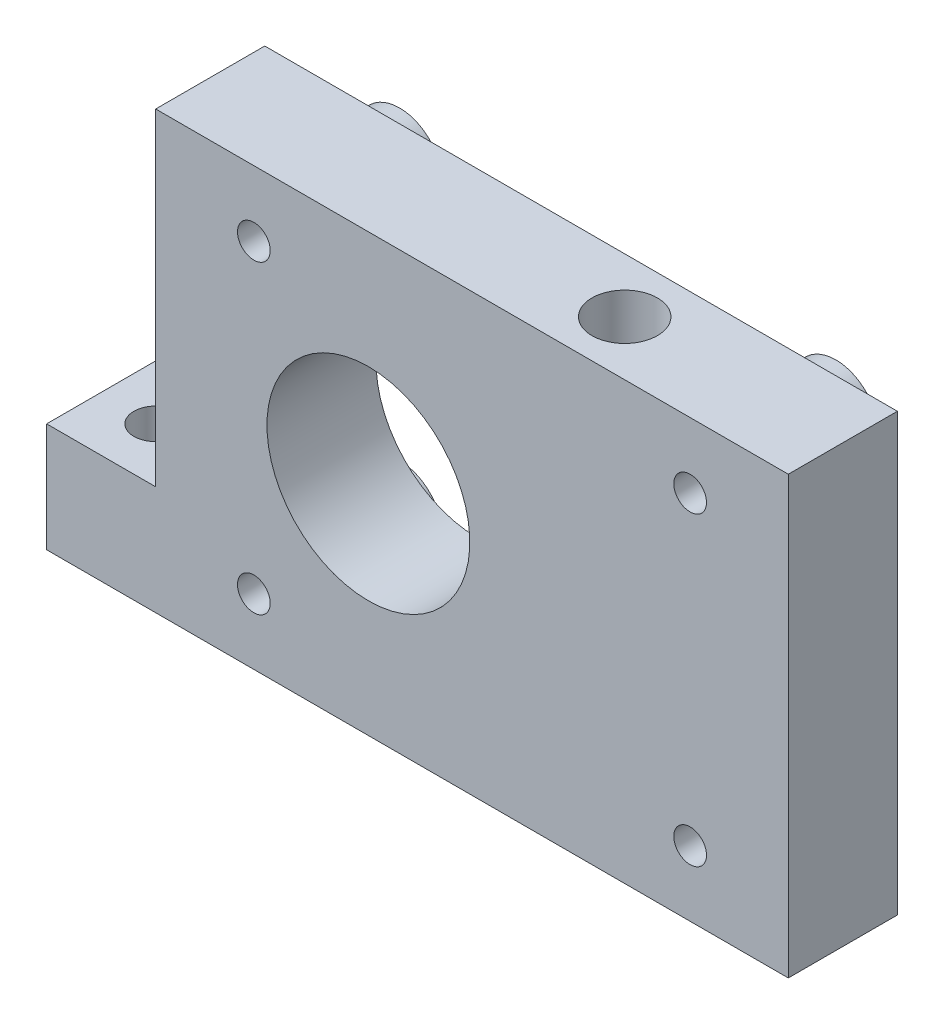
ISO-10303-21;
HEADER;
FILE_DESCRIPTION(('STEP AP214'),'2;1');
FILE_NAME('part.step','',(''),(''),'','','');
FILE_SCHEMA(('AUTOMOTIVE_DESIGN { 1 0 10303 214 1 1 1 1 }'));
ENDSEC;
DATA;
#1=APPLICATION_CONTEXT('core data for automotive mechanical design processes');
#2=APPLICATION_PROTOCOL_DEFINITION('international standard','automotive_design',2000,#1);
#3=PRODUCT_CONTEXT('',#1,'mechanical');
#4=PRODUCT('Part','Part','',(#3));
#5=PRODUCT_RELATED_PRODUCT_CATEGORY('part','',(#4));
#6=PRODUCT_DEFINITION_FORMATION('','',#4);
#7=PRODUCT_DEFINITION_CONTEXT('part definition',#1,'design');
#8=PRODUCT_DEFINITION('design','',#6,#7);
#9=PRODUCT_DEFINITION_SHAPE('','',#8);
#10=(LENGTH_UNIT() NAMED_UNIT(*) SI_UNIT(.MILLI.,.METRE.));
#11=(NAMED_UNIT(*) PLANE_ANGLE_UNIT() SI_UNIT($,.RADIAN.));
#12=(NAMED_UNIT(*) SI_UNIT($,.STERADIAN.) SOLID_ANGLE_UNIT());
#13=UNCERTAINTY_MEASURE_WITH_UNIT(LENGTH_MEASURE(1.E-05),#10,'distance_accuracy_value','');
#14=(GEOMETRIC_REPRESENTATION_CONTEXT(3) GLOBAL_UNCERTAINTY_ASSIGNED_CONTEXT((#13)) GLOBAL_UNIT_ASSIGNED_CONTEXT((#10,
#11,#12)) REPRESENTATION_CONTEXT('',''));
#15=CARTESIAN_POINT('',(0.,0.,0.));
#16=DIRECTION('',(0.,0.,1.));
#17=DIRECTION('',(1.,0.,0.));
#18=AXIS2_PLACEMENT_3D('',#15,#16,#17);
#19=CARTESIAN_POINT('',(-49.,7.8359502095322,24.3924178005197));
#20=DIRECTION('',(0.,0.,-1.));
#21=DIRECTION('',(-1.,0.,0.));
#22=AXIS2_PLACEMENT_3D('',#19,#20,#21);
#23=CYLINDRICAL_SURFACE('',#22,3.9);
#24=CARTESIAN_POINT('',(-49.,7.8359502095322,0.));
#25=DIRECTION('',(0.,0.,1.));
#26=DIRECTION('',(1.,0.,0.));
#27=AXIS2_PLACEMENT_3D('',#24,#25,#26);
#28=CIRCLE('',#27,3.9);
#29=CARTESIAN_POINT('',(-45.1,7.8359502095322,0.));
#30=VERTEX_POINT('',#29);
#31=EDGE_CURVE('E278',#30,#30,#28,.T.);
#32=ORIENTED_EDGE('',*,*,#31,.T.);
#33=EDGE_LOOP('',(#32));
#34=FACE_BOUND('',#33,.T.);
#35=CARTESIAN_POINT('',(-49.,7.8359502095322,3.36155201400951));
#36=DIRECTION('',(0.,0.,1.));
#37=DIRECTION('',(0.,-1.,0.));
#38=AXIS2_PLACEMENT_3D('',#35,#36,#37);
#39=CIRCLE('',#38,3.9);
#40=CARTESIAN_POINT('',(-49.,3.9359502095322,3.36155201400951));
#41=VERTEX_POINT('',#40);
#42=EDGE_CURVE('E12',#41,#41,#39,.T.);
#43=ORIENTED_EDGE('',*,*,#42,.F.);
#44=EDGE_LOOP('',(#43));
#45=FACE_BOUND('',#44,.T.);
#46=ADVANCED_FACE('F110',(#34,#45),#23,.T.);
#47=CARTESIAN_POINT('',(-49.,7.8359502095322,0.));
#48=DIRECTION('',(0.,0.,1.));
#49=DIRECTION('',(1.,0.,0.));
#50=AXIS2_PLACEMENT_3D('',#47,#48,#49);
#51=PLANE('',#50);
#52=ORIENTED_EDGE('',*,*,#31,.F.);
#53=EDGE_LOOP('',(#52));
#54=FACE_BOUND('',#53,.T.);
#55=CARTESIAN_POINT('',(-49.,7.8359502095322,0.));
#56=DIRECTION('',(0.,0.,1.));
#57=DIRECTION('',(1.,0.,0.));
#58=AXIS2_PLACEMENT_3D('',#55,#56,#57);
#59=CIRCLE('',#58,1.5);
#60=CARTESIAN_POINT('',(-47.5,7.8359502095322,0.));
#61=VERTEX_POINT('',#60);
#62=EDGE_CURVE('E274',#61,#61,#59,.T.);
#63=ORIENTED_EDGE('',*,*,#62,.T.);
#64=EDGE_LOOP('',(#63));
#65=FACE_BOUND('',#64,.T.);
#66=ADVANCED_FACE('F291',(#54,#65),#51,.F.);
#67=CARTESIAN_POINT('',(-49.,7.8359502095322,24.3924178005197));
#68=DIRECTION('',(0.,0.,-1.));
#69=DIRECTION('',(-1.,0.,0.));
#70=AXIS2_PLACEMENT_3D('',#67,#68,#69);
#71=CYLINDRICAL_SURFACE('',#70,1.5);
#72=CARTESIAN_POINT('',(-49.,7.8359502095322,13.3615520140095));
#73=DIRECTION('',(0.,0.,-1.));
#74=DIRECTION('',(0.,1.,0.));
#75=AXIS2_PLACEMENT_3D('',#72,#73,#74);
#76=CIRCLE('',#75,1.5);
#77=CARTESIAN_POINT('',(-49.,9.3359502095322,13.3615520140095));
#78=VERTEX_POINT('',#77);
#79=EDGE_CURVE('E119',#78,#78,#76,.T.);
#80=ORIENTED_EDGE('',*,*,#79,.F.);
#81=EDGE_LOOP('',(#80));
#82=FACE_BOUND('',#81,.T.);
#83=ORIENTED_EDGE('',*,*,#62,.F.);
#84=EDGE_LOOP('',(#83));
#85=FACE_BOUND('',#84,.T.);
#86=ADVANCED_FACE('F288',(#82,#85),#71,.F.);
#87=CARTESIAN_POINT('',(-54.3475713263686,-9.86404979047036,13.3615520140095));
#88=DIRECTION('',(0.,0.,-1.));
#89=DIRECTION('',(1.,0.,0.));
#90=AXIS2_PLACEMENT_3D('',#87,#88,#89);
#91=PLANE('',#90);
#92=ORIENTED_EDGE('',*,*,#79,.T.);
#93=EDGE_LOOP('',(#92));
#94=FACE_BOUND('',#93,.T.);
#95=DIRECTION('',(1.,0.,0.));
#96=VECTOR('',#95,1.);
#97=CARTESIAN_POINT('',(-54.3475713263686,1.83595020953219,13.3615520140095));
#98=LINE('',#97,#96);
#99=CARTESIAN_POINT('',(-68.,1.83595020952963,13.3615520140095));
#100=VERTEX_POINT('',#99);
#101=CARTESIAN_POINT('',(0.,1.8359502095322,13.3615520140095));
#102=VERTEX_POINT('',#101);
#103=EDGE_CURVE('E255',#100,#102,#98,.T.);
#104=ORIENTED_EDGE('',*,*,#103,.T.);
#105=DIRECTION('',(0.,1.,0.));
#106=VECTOR('',#105,1.);
#107=CARTESIAN_POINT('',(0.,-9.86404979047036,13.3615520140095));
#108=LINE('',#107,#106);
#109=CARTESIAN_POINT('',(0.,41.8359502095322,13.3615520140095));
#110=VERTEX_POINT('',#109);
#111=EDGE_CURVE('E267',#102,#110,#108,.T.);
#112=ORIENTED_EDGE('',*,*,#111,.T.);
#113=DIRECTION('',(-1.,0.,0.));
#114=VECTOR('',#113,1.);
#115=CARTESIAN_POINT('',(-54.3475713263686,41.8359502095322,13.3615520140095));
#116=LINE('',#115,#114);
#117=CARTESIAN_POINT('',(-58.,41.8359502095322,13.3615520140095));
#118=VERTEX_POINT('',#117);
#119=EDGE_CURVE('E270',#110,#118,#116,.T.);
#120=ORIENTED_EDGE('',*,*,#119,.T.);
#121=DIRECTION('',(0.,-1.,0.));
#122=VECTOR('',#121,1.);
#123=CARTESIAN_POINT('',(-58.,-9.86404979047036,13.3615520140095));
#124=LINE('',#123,#122);
#125=CARTESIAN_POINT('',(-58.,11.8359502095296,13.3615520140095));
#126=VERTEX_POINT('',#125);
#127=EDGE_CURVE('E262',#118,#126,#124,.T.);
#128=ORIENTED_EDGE('',*,*,#127,.T.);
#129=DIRECTION('',(1.,0.,0.));
#130=VECTOR('',#129,1.);
#131=CARTESIAN_POINT('',(-58.,11.8359502095296,13.3615520140095));
#132=LINE('',#131,#130);
#133=CARTESIAN_POINT('',(-68.,11.8359502095296,13.3615520140095));
#134=VERTEX_POINT('',#133);
#135=EDGE_CURVE('E190',#134,#126,#132,.T.);
#136=ORIENTED_EDGE('',*,*,#135,.F.);
#137=DIRECTION('',(0.,-1.,0.));
#138=VECTOR('',#137,1.);
#139=CARTESIAN_POINT('',(-68.,11.8359502095296,13.3615520140095));
#140=LINE('',#139,#138);
#141=EDGE_CURVE('E201',#134,#100,#140,.T.);
#142=ORIENTED_EDGE('',*,*,#141,.T.);
#143=EDGE_LOOP('',(#104,#112,#120,#128,#136,#142));
#144=FACE_BOUND('',#143,.T.);
#145=CARTESIAN_POINT('',(-38.5,21.8359502095322,13.3615520140095));
#146=DIRECTION('',(0.,0.,-1.));
#147=DIRECTION('',(0.,1.,0.));
#148=AXIS2_PLACEMENT_3D('',#145,#146,#147);
#149=CIRCLE('',#148,9.3);
#150=CARTESIAN_POINT('',(-38.5,31.1359502095322,13.3615520140095));
#151=VERTEX_POINT('',#150);
#152=EDGE_CURVE('E251',#151,#151,#149,.T.);
#153=ORIENTED_EDGE('',*,*,#152,.T.);
#154=EDGE_LOOP('',(#153));
#155=FACE_BOUND('',#154,.T.);
#156=CARTESIAN_POINT('',(-49.,35.8359502095322,13.3615520140095));
#157=DIRECTION('',(0.,0.,-1.));
#158=DIRECTION('',(0.,1.,0.));
#159=AXIS2_PLACEMENT_3D('',#156,#157,#158);
#160=CIRCLE('',#159,1.5);
#161=CARTESIAN_POINT('',(-49.,37.3359502095322,13.3615520140095));
#162=VERTEX_POINT('',#161);
#163=EDGE_CURVE('E237',#162,#162,#160,.T.);
#164=ORIENTED_EDGE('',*,*,#163,.T.);
#165=EDGE_LOOP('',(#164));
#166=FACE_BOUND('',#165,.T.);
#167=CARTESIAN_POINT('',(-9.,35.8359502095322,13.3615520140095));
#168=DIRECTION('',(0.,0.,-1.));
#169=DIRECTION('',(0.,1.,0.));
#170=AXIS2_PLACEMENT_3D('',#167,#168,#169);
#171=CIRCLE('',#170,1.5);
#172=CARTESIAN_POINT('',(-9.,37.3359502095322,13.3615520140095));
#173=VERTEX_POINT('',#172);
#174=EDGE_CURVE('E228',#173,#173,#171,.T.);
#175=ORIENTED_EDGE('',*,*,#174,.T.);
#176=EDGE_LOOP('',(#175));
#177=FACE_BOUND('',#176,.T.);
#178=CARTESIAN_POINT('',(-9.,7.8359502095322,13.3615520140095));
#179=DIRECTION('',(0.,0.,-1.));
#180=DIRECTION('',(0.,1.,0.));
#181=AXIS2_PLACEMENT_3D('',#178,#179,#180);
#182=CIRCLE('',#181,1.5);
#183=CARTESIAN_POINT('',(-9.,9.3359502095322,13.3615520140095));
#184=VERTEX_POINT('',#183);
#185=EDGE_CURVE('E219',#184,#184,#182,.T.);
#186=ORIENTED_EDGE('',*,*,#185,.T.);
#187=EDGE_LOOP('',(#186));
#188=FACE_BOUND('',#187,.T.);
#189=ADVANCED_FACE('F112',(#94,#144,#155,#166,#177,#188),#91,.F.);
#190=CARTESIAN_POINT('',(0.,0.,3.36155201400951));
#191=DIRECTION('',(0.,0.,1.));
#192=DIRECTION('',(0.,-1.,0.));
#193=AXIS2_PLACEMENT_3D('',#190,#191,#192);
#194=PLANE('',#193);
#195=DIRECTION('',(1.,0.,0.));
#196=VECTOR('',#195,1.);
#197=CARTESIAN_POINT('',(-54.3475713263686,1.83595020953219,3.36155201400951));
#198=LINE('',#197,#196);
#199=CARTESIAN_POINT('',(-68.,1.83595020952963,3.36155201400952));
#200=VERTEX_POINT('',#199);
#201=CARTESIAN_POINT('',(0.,1.8359502095322,3.36155201400951));
#202=VERTEX_POINT('',#201);
#203=EDGE_CURVE('E258',#200,#202,#198,.T.);
#204=ORIENTED_EDGE('',*,*,#203,.F.);
#205=DIRECTION('',(0.,-1.,0.));
#206=VECTOR('',#205,1.);
#207=CARTESIAN_POINT('',(-68.,11.8359502095296,3.36155201400952));
#208=LINE('',#207,#206);
#209=CARTESIAN_POINT('',(-68.,11.8359502095296,3.36155201400952));
#210=VERTEX_POINT('',#209);
#211=EDGE_CURVE('E181',#210,#200,#208,.T.);
#212=ORIENTED_EDGE('',*,*,#211,.F.);
#213=DIRECTION('',(-1.,0.,0.));
#214=VECTOR('',#213,1.);
#215=CARTESIAN_POINT('',(-58.,11.8359502095296,3.36155201400951));
#216=LINE('',#215,#214);
#217=CARTESIAN_POINT('',(-58.,11.8359502095296,3.36155201400951));
#218=VERTEX_POINT('',#217);
#219=EDGE_CURVE('E177',#218,#210,#216,.T.);
#220=ORIENTED_EDGE('',*,*,#219,.F.);
#221=DIRECTION('',(0.,-1.,0.));
#222=VECTOR('',#221,1.);
#223=CARTESIAN_POINT('',(-58.,-9.86404979047036,3.36155201400951));
#224=LINE('',#223,#222);
#225=CARTESIAN_POINT('',(-58.,41.8359502095322,3.36155201400951));
#226=VERTEX_POINT('',#225);
#227=EDGE_CURVE('E169',#226,#218,#224,.T.);
#228=ORIENTED_EDGE('',*,*,#227,.F.);
#229=DIRECTION('',(-1.,0.,0.));
#230=VECTOR('',#229,1.);
#231=CARTESIAN_POINT('',(-54.3475713263686,41.8359502095322,3.36155201400951));
#232=LINE('',#231,#230);
#233=CARTESIAN_POINT('',(0.,41.8359502095322,3.36155201400951));
#234=VERTEX_POINT('',#233);
#235=EDGE_CURVE('E174',#234,#226,#232,.T.);
#236=ORIENTED_EDGE('',*,*,#235,.F.);
#237=DIRECTION('',(0.,1.,0.));
#238=VECTOR('',#237,1.);
#239=CARTESIAN_POINT('',(0.,-9.86404979047036,3.36155201400951));
#240=LINE('',#239,#238);
#241=EDGE_CURVE('E261',#202,#234,#240,.T.);
#242=ORIENTED_EDGE('',*,*,#241,.F.);
#243=EDGE_LOOP('',(#204,#212,#220,#228,#236,#242));
#244=FACE_BOUND('',#243,.T.);
#245=CARTESIAN_POINT('',(-38.5,21.8359502095322,3.36155201400951));
#246=DIRECTION('',(0.,0.,-1.));
#247=DIRECTION('',(0.,1.,0.));
#248=AXIS2_PLACEMENT_3D('',#245,#246,#247);
#249=CIRCLE('',#248,9.3);
#250=CARTESIAN_POINT('',(-38.5,31.1359502095322,3.36155201400951));
#251=VERTEX_POINT('',#250);
#252=EDGE_CURVE('E252',#251,#251,#249,.T.);
#253=ORIENTED_EDGE('',*,*,#252,.F.);
#254=EDGE_LOOP('',(#253));
#255=FACE_BOUND('',#254,.T.);
#256=CARTESIAN_POINT('',(-49.,35.8359502095322,3.36155201400951));
#257=DIRECTION('',(0.,0.,-1.));
#258=DIRECTION('',(0.,1.,0.));
#259=AXIS2_PLACEMENT_3D('',#256,#257,#258);
#260=CIRCLE('',#259,3.9);
#261=CARTESIAN_POINT('',(-49.,39.7359502095322,3.36155201400951));
#262=VERTEX_POINT('',#261);
#263=EDGE_CURVE('E248',#262,#262,#260,.T.);
#264=ORIENTED_EDGE('',*,*,#263,.F.);
#265=EDGE_LOOP('',(#264));
#266=FACE_BOUND('',#265,.T.);
#267=ORIENTED_EDGE('',*,*,#42,.T.);
#268=EDGE_LOOP('',(#267));
#269=FACE_BOUND('',#268,.T.);
#270=CARTESIAN_POINT('',(-9.00000000000001,35.8359502095322,3.36155201400951));
#271=DIRECTION('',(0.,0.,-1.));
#272=DIRECTION('',(0.,1.,0.));
#273=AXIS2_PLACEMENT_3D('',#270,#271,#272);
#274=CIRCLE('',#273,3.9);
#275=CARTESIAN_POINT('',(-9.00000000000001,39.7359502095322,3.36155201400951));
#276=VERTEX_POINT('',#275);
#277=EDGE_CURVE('E245',#276,#276,#274,.T.);
#278=ORIENTED_EDGE('',*,*,#277,.F.);
#279=EDGE_LOOP('',(#278));
#280=FACE_BOUND('',#279,.T.);
#281=CARTESIAN_POINT('',(-8.99999999999999,7.83595020953221,3.36155201400951));
#282=DIRECTION('',(0.,0.,-1.));
#283=DIRECTION('',(0.,1.,0.));
#284=AXIS2_PLACEMENT_3D('',#281,#282,#283);
#285=CIRCLE('',#284,3.9);
#286=CARTESIAN_POINT('',(-8.99999999999999,11.7359502095322,3.36155201400951));
#287=VERTEX_POINT('',#286);
#288=EDGE_CURVE('E242',#287,#287,#285,.T.);
#289=ORIENTED_EDGE('',*,*,#288,.F.);
#290=EDGE_LOOP('',(#289));
#291=FACE_BOUND('',#290,.T.);
#292=ADVANCED_FACE('F178',(#244,#255,#266,#269,#280,#291),#194,.F.);
#293=CARTESIAN_POINT('',(-54.3475713263686,1.83595020953219,3.36155201400951));
#294=DIRECTION('',(0.,-1.,0.));
#295=DIRECTION('',(1.,0.,0.));
#296=AXIS2_PLACEMENT_3D('',#293,#294,#295);
#297=PLANE('',#296);
#298=CARTESIAN_POINT('',(-20.,1.83595020953219,8.36155201400951));
#299=DIRECTION('',(0.,1.,0.));
#300=DIRECTION('',(-1.,0.,0.));
#301=AXIS2_PLACEMENT_3D('',#298,#299,#300);
#302=CIRCLE('',#301,2.);
#303=CARTESIAN_POINT('',(-22.,1.83595020953219,8.36155201400951));
#304=VERTEX_POINT('',#303);
#305=EDGE_CURVE('E206',#304,#304,#302,.T.);
#306=ORIENTED_EDGE('',*,*,#305,.T.);
#307=EDGE_LOOP('',(#306));
#308=FACE_BOUND('',#307,.T.);
#309=ORIENTED_EDGE('',*,*,#103,.F.);
#310=DIRECTION('',(0.,0.,1.));
#311=VECTOR('',#310,1.);
#312=CARTESIAN_POINT('',(-68.,1.83595020952963,3.36155201400952));
#313=LINE('',#312,#311);
#314=EDGE_CURVE('E191',#200,#100,#313,.T.);
#315=ORIENTED_EDGE('',*,*,#314,.F.);
#316=ORIENTED_EDGE('',*,*,#203,.T.);
#317=DIRECTION('',(0.,0.,1.));
#318=VECTOR('',#317,1.);
#319=CARTESIAN_POINT('',(0.,1.8359502095322,3.36155201400951));
#320=LINE('',#319,#318);
#321=EDGE_CURVE('E153',#202,#102,#320,.T.);
#322=ORIENTED_EDGE('',*,*,#321,.T.);
#323=EDGE_LOOP('',(#309,#315,#316,#322));
#324=FACE_BOUND('',#323,.T.);
#325=CARTESIAN_POINT('',(-63.,1.83595020952963,8.36155201400951));
#326=DIRECTION('',(0.,1.,0.));
#327=DIRECTION('',(-1.,0.,0.));
#328=AXIS2_PLACEMENT_3D('',#325,#326,#327);
#329=CIRCLE('',#328,2.);
#330=CARTESIAN_POINT('',(-65.,1.83595020952963,8.36155201400951));
#331=VERTEX_POINT('',#330);
#332=EDGE_CURVE('E197',#331,#331,#329,.T.);
#333=ORIENTED_EDGE('',*,*,#332,.T.);
#334=EDGE_LOOP('',(#333));
#335=FACE_BOUND('',#334,.T.);
#336=ADVANCED_FACE('F304',(#308,#324,#335),#297,.T.);
#337=CARTESIAN_POINT('',(-58.,-9.86404979047036,3.36155201400951));
#338=DIRECTION('',(-1.,0.,0.));
#339=DIRECTION('',(0.,-1.,0.));
#340=AXIS2_PLACEMENT_3D('',#337,#338,#339);
#341=PLANE('',#340);
#342=DIRECTION('',(0.,0.,-1.));
#343=VECTOR('',#342,1.);
#344=CARTESIAN_POINT('',(-58.,11.8359502095296,3.36155201400951));
#345=LINE('',#344,#343);
#346=EDGE_CURVE('E126',#126,#218,#345,.T.);
#347=ORIENTED_EDGE('',*,*,#346,.F.);
#348=ORIENTED_EDGE('',*,*,#127,.F.);
#349=DIRECTION('',(0.,0.,1.));
#350=VECTOR('',#349,1.);
#351=CARTESIAN_POINT('',(-58.,41.8359502095322,3.36155201400951));
#352=LINE('',#351,#350);
#353=EDGE_CURVE('E132',#226,#118,#352,.T.);
#354=ORIENTED_EDGE('',*,*,#353,.F.);
#355=ORIENTED_EDGE('',*,*,#227,.T.);
#356=EDGE_LOOP('',(#347,#348,#354,#355));
#357=FACE_BOUND('',#356,.T.);
#358=ADVANCED_FACE('F171',(#357),#341,.T.);
#359=CARTESIAN_POINT('',(-54.3475713263686,41.8359502095322,3.36155201400951));
#360=DIRECTION('',(0.,1.,0.));
#361=DIRECTION('',(-1.,0.,0.));
#362=AXIS2_PLACEMENT_3D('',#359,#360,#361);
#363=PLANE('',#362);
#364=CARTESIAN_POINT('',(-20.,41.8359502095322,8.36155201400951));
#365=DIRECTION('',(0.,1.,0.));
#366=DIRECTION('',(-1.,0.,0.));
#367=AXIS2_PLACEMENT_3D('',#364,#365,#366);
#368=CIRCLE('',#367,3.);
#369=CARTESIAN_POINT('',(-23.,41.8359502095322,8.36155201400951));
#370=VERTEX_POINT('',#369);
#371=EDGE_CURVE('E213',#370,#370,#368,.T.);
#372=ORIENTED_EDGE('',*,*,#371,.F.);
#373=EDGE_LOOP('',(#372));
#374=FACE_BOUND('',#373,.T.);
#375=ORIENTED_EDGE('',*,*,#119,.F.);
#376=DIRECTION('',(0.,0.,1.));
#377=VECTOR('',#376,1.);
#378=CARTESIAN_POINT('',(0.,41.8359502095322,3.36155201400951));
#379=LINE('',#378,#377);
#380=EDGE_CURVE('E275',#234,#110,#379,.T.);
#381=ORIENTED_EDGE('',*,*,#380,.F.);
#382=ORIENTED_EDGE('',*,*,#235,.T.);
#383=ORIENTED_EDGE('',*,*,#353,.T.);
#384=EDGE_LOOP('',(#375,#381,#382,#383));
#385=FACE_BOUND('',#384,.T.);
#386=ADVANCED_FACE('F312',(#374,#385),#363,.T.);
#387=CARTESIAN_POINT('',(0.,-9.86404979047036,3.36155201400951));
#388=DIRECTION('',(1.,0.,0.));
#389=DIRECTION('',(0.,1.,0.));
#390=AXIS2_PLACEMENT_3D('',#387,#388,#389);
#391=PLANE('',#390);
#392=ORIENTED_EDGE('',*,*,#111,.F.);
#393=ORIENTED_EDGE('',*,*,#321,.F.);
#394=ORIENTED_EDGE('',*,*,#241,.T.);
#395=ORIENTED_EDGE('',*,*,#380,.T.);
#396=EDGE_LOOP('',(#392,#393,#394,#395));
#397=FACE_BOUND('',#396,.T.);
#398=ADVANCED_FACE('F308',(#397),#391,.T.);
#399=CARTESIAN_POINT('',(-38.5,21.8359502095322,3.36155201400951));
#400=DIRECTION('',(0.,0.,1.));
#401=DIRECTION('',(1.,0.,0.));
#402=AXIS2_PLACEMENT_3D('',#399,#400,#401);
#403=CYLINDRICAL_SURFACE('',#402,9.3);
#404=ORIENTED_EDGE('',*,*,#252,.T.);
#405=EDGE_LOOP('',(#404));
#406=FACE_BOUND('',#405,.T.);
#407=ORIENTED_EDGE('',*,*,#152,.F.);
#408=EDGE_LOOP('',(#407));
#409=FACE_BOUND('',#408,.T.);
#410=ADVANCED_FACE('F311',(#406,#409),#403,.F.);
#411=CARTESIAN_POINT('',(-49.,35.8359502095322,24.3924178005197));
#412=DIRECTION('',(0.,0.,-1.));
#413=DIRECTION('',(-1.,0.,0.));
#414=AXIS2_PLACEMENT_3D('',#411,#412,#413);
#415=CYLINDRICAL_SURFACE('',#414,3.9);
#416=CARTESIAN_POINT('',(-49.,35.8359502095322,0.));
#417=DIRECTION('',(0.,0.,1.));
#418=DIRECTION('',(1.,0.,0.));
#419=AXIS2_PLACEMENT_3D('',#416,#417,#418);
#420=CIRCLE('',#419,3.9);
#421=CARTESIAN_POINT('',(-45.1,35.8359502095322,0.));
#422=VERTEX_POINT('',#421);
#423=EDGE_CURVE('E234',#422,#422,#420,.T.);
#424=ORIENTED_EDGE('',*,*,#423,.T.);
#425=EDGE_LOOP('',(#424));
#426=FACE_BOUND('',#425,.T.);
#427=ORIENTED_EDGE('',*,*,#263,.T.);
#428=EDGE_LOOP('',(#427));
#429=FACE_BOUND('',#428,.T.);
#430=ADVANCED_FACE('F322',(#426,#429),#415,.T.);
#431=CARTESIAN_POINT('',(-49.,35.8359502095322,0.));
#432=DIRECTION('',(0.,0.,1.));
#433=DIRECTION('',(1.,0.,0.));
#434=AXIS2_PLACEMENT_3D('',#431,#432,#433);
#435=PLANE('',#434);
#436=ORIENTED_EDGE('',*,*,#423,.F.);
#437=EDGE_LOOP('',(#436));
#438=FACE_BOUND('',#437,.T.);
#439=CARTESIAN_POINT('',(-49.,35.8359502095322,0.));
#440=DIRECTION('',(0.,0.,1.));
#441=DIRECTION('',(1.,0.,0.));
#442=AXIS2_PLACEMENT_3D('',#439,#440,#441);
#443=CIRCLE('',#442,1.5);
#444=CARTESIAN_POINT('',(-47.5,35.8359502095322,0.));
#445=VERTEX_POINT('',#444);
#446=EDGE_CURVE('E233',#445,#445,#443,.T.);
#447=ORIENTED_EDGE('',*,*,#446,.T.);
#448=EDGE_LOOP('',(#447));
#449=FACE_BOUND('',#448,.T.);
#450=ADVANCED_FACE('F328',(#438,#449),#435,.F.);
#451=CARTESIAN_POINT('',(-49.,35.8359502095322,24.3924178005197));
#452=DIRECTION('',(0.,0.,-1.));
#453=DIRECTION('',(-1.,0.,0.));
#454=AXIS2_PLACEMENT_3D('',#451,#452,#453);
#455=CYLINDRICAL_SURFACE('',#454,1.5);
#456=ORIENTED_EDGE('',*,*,#163,.F.);
#457=EDGE_LOOP('',(#456));
#458=FACE_BOUND('',#457,.T.);
#459=ORIENTED_EDGE('',*,*,#446,.F.);
#460=EDGE_LOOP('',(#459));
#461=FACE_BOUND('',#460,.T.);
#462=ADVANCED_FACE('F324',(#458,#461),#455,.F.);
#463=CARTESIAN_POINT('',(-9.,35.8359502095322,24.3924178005197));
#464=DIRECTION('',(0.,0.,-1.));
#465=DIRECTION('',(-1.,0.,0.));
#466=AXIS2_PLACEMENT_3D('',#463,#464,#465);
#467=CYLINDRICAL_SURFACE('',#466,3.9);
#468=CARTESIAN_POINT('',(-9.,35.8359502095322,0.));
#469=DIRECTION('',(0.,0.,1.));
#470=DIRECTION('',(1.,0.,0.));
#471=AXIS2_PLACEMENT_3D('',#468,#469,#470);
#472=CIRCLE('',#471,3.9);
#473=CARTESIAN_POINT('',(-5.1,35.8359502095322,0.));
#474=VERTEX_POINT('',#473);
#475=EDGE_CURVE('E225',#474,#474,#472,.T.);
#476=ORIENTED_EDGE('',*,*,#475,.T.);
#477=EDGE_LOOP('',(#476));
#478=FACE_BOUND('',#477,.T.);
#479=ORIENTED_EDGE('',*,*,#277,.T.);
#480=EDGE_LOOP('',(#479));
#481=FACE_BOUND('',#480,.T.);
#482=ADVANCED_FACE('F327',(#478,#481),#467,.T.);
#483=CARTESIAN_POINT('',(-9.,35.8359502095322,0.));
#484=DIRECTION('',(0.,0.,1.));
#485=DIRECTION('',(1.,0.,0.));
#486=AXIS2_PLACEMENT_3D('',#483,#484,#485);
#487=PLANE('',#486);
#488=ORIENTED_EDGE('',*,*,#475,.F.);
#489=EDGE_LOOP('',(#488));
#490=FACE_BOUND('',#489,.T.);
#491=CARTESIAN_POINT('',(-9.,35.8359502095322,0.));
#492=DIRECTION('',(0.,0.,1.));
#493=DIRECTION('',(1.,0.,0.));
#494=AXIS2_PLACEMENT_3D('',#491,#492,#493);
#495=CIRCLE('',#494,1.5);
#496=CARTESIAN_POINT('',(-7.5,35.8359502095322,0.));
#497=VERTEX_POINT('',#496);
#498=EDGE_CURVE('E224',#497,#497,#495,.T.);
#499=ORIENTED_EDGE('',*,*,#498,.T.);
#500=EDGE_LOOP('',(#499));
#501=FACE_BOUND('',#500,.T.);
#502=ADVANCED_FACE('F340',(#490,#501),#487,.F.);
#503=CARTESIAN_POINT('',(-9.,35.8359502095322,24.3924178005197));
#504=DIRECTION('',(0.,0.,-1.));
#505=DIRECTION('',(-1.,0.,0.));
#506=AXIS2_PLACEMENT_3D('',#503,#504,#505);
#507=CYLINDRICAL_SURFACE('',#506,1.5);
#508=ORIENTED_EDGE('',*,*,#174,.F.);
#509=EDGE_LOOP('',(#508));
#510=FACE_BOUND('',#509,.T.);
#511=ORIENTED_EDGE('',*,*,#498,.F.);
#512=EDGE_LOOP('',(#511));
#513=FACE_BOUND('',#512,.T.);
#514=ADVANCED_FACE('F336',(#510,#513),#507,.F.);
#515=CARTESIAN_POINT('',(-9.,7.8359502095322,24.3924178005197));
#516=DIRECTION('',(0.,0.,-1.));
#517=DIRECTION('',(-1.,0.,0.));
#518=AXIS2_PLACEMENT_3D('',#515,#516,#517);
#519=CYLINDRICAL_SURFACE('',#518,3.9);
#520=CARTESIAN_POINT('',(-9.,7.8359502095322,0.));
#521=DIRECTION('',(0.,0.,1.));
#522=DIRECTION('',(1.,0.,0.));
#523=AXIS2_PLACEMENT_3D('',#520,#521,#522);
#524=CIRCLE('',#523,3.9);
#525=CARTESIAN_POINT('',(-5.1,7.8359502095322,0.));
#526=VERTEX_POINT('',#525);
#527=EDGE_CURVE('E216',#526,#526,#524,.T.);
#528=ORIENTED_EDGE('',*,*,#527,.T.);
#529=EDGE_LOOP('',(#528));
#530=FACE_BOUND('',#529,.T.);
#531=ORIENTED_EDGE('',*,*,#288,.T.);
#532=EDGE_LOOP('',(#531));
#533=FACE_BOUND('',#532,.T.);
#534=ADVANCED_FACE('F339',(#530,#533),#519,.T.);
#535=CARTESIAN_POINT('',(-9.,7.8359502095322,0.));
#536=DIRECTION('',(0.,0.,1.));
#537=DIRECTION('',(1.,0.,0.));
#538=AXIS2_PLACEMENT_3D('',#535,#536,#537);
#539=PLANE('',#538);
#540=ORIENTED_EDGE('',*,*,#527,.F.);
#541=EDGE_LOOP('',(#540));
#542=FACE_BOUND('',#541,.T.);
#543=CARTESIAN_POINT('',(-9.,7.8359502095322,0.));
#544=DIRECTION('',(0.,0.,1.));
#545=DIRECTION('',(1.,0.,0.));
#546=AXIS2_PLACEMENT_3D('',#543,#544,#545);
#547=CIRCLE('',#546,1.5);
#548=CARTESIAN_POINT('',(-7.5,7.8359502095322,0.));
#549=VERTEX_POINT('',#548);
#550=EDGE_CURVE('E212',#549,#549,#547,.T.);
#551=ORIENTED_EDGE('',*,*,#550,.T.);
#552=EDGE_LOOP('',(#551));
#553=FACE_BOUND('',#552,.T.);
#554=ADVANCED_FACE('F352',(#542,#553),#539,.F.);
#555=CARTESIAN_POINT('',(-9.,7.8359502095322,24.3924178005197));
#556=DIRECTION('',(0.,0.,-1.));
#557=DIRECTION('',(-1.,0.,0.));
#558=AXIS2_PLACEMENT_3D('',#555,#556,#557);
#559=CYLINDRICAL_SURFACE('',#558,1.5);
#560=ORIENTED_EDGE('',*,*,#185,.F.);
#561=EDGE_LOOP('',(#560));
#562=FACE_BOUND('',#561,.T.);
#563=ORIENTED_EDGE('',*,*,#550,.F.);
#564=EDGE_LOOP('',(#563));
#565=FACE_BOUND('',#564,.T.);
#566=ADVANCED_FACE('F348',(#562,#565),#559,.F.);
#567=CARTESIAN_POINT('',(-20.,16.8359502095322,8.36155201400951));
#568=DIRECTION('',(0.,1.,0.));
#569=DIRECTION('',(-1.,0.,0.));
#570=AXIS2_PLACEMENT_3D('',#567,#568,#569);
#571=CYLINDRICAL_SURFACE('',#570,3.);
#572=CARTESIAN_POINT('',(-20.,16.8359502095322,8.36155201400951));
#573=DIRECTION('',(0.,1.,0.));
#574=DIRECTION('',(-1.,0.,0.));
#575=AXIS2_PLACEMENT_3D('',#572,#573,#574);
#576=CIRCLE('',#575,3.);
#577=CARTESIAN_POINT('',(-23.,16.8359502095322,8.36155201400951));
#578=VERTEX_POINT('',#577);
#579=EDGE_CURVE('E209',#578,#578,#576,.T.);
#580=ORIENTED_EDGE('',*,*,#579,.F.);
#581=EDGE_LOOP('',(#580));
#582=FACE_BOUND('',#581,.T.);
#583=ORIENTED_EDGE('',*,*,#371,.T.);
#584=EDGE_LOOP('',(#583));
#585=FACE_BOUND('',#584,.T.);
#586=ADVANCED_FACE('F351',(#582,#585),#571,.F.);
#587=CARTESIAN_POINT('',(0.,16.8359502095322,0.));
#588=DIRECTION('',(0.,1.,0.));
#589=DIRECTION('',(-1.,0.,0.));
#590=AXIS2_PLACEMENT_3D('',#587,#588,#589);
#591=PLANE('',#590);
#592=CARTESIAN_POINT('',(-20.,16.8359502095322,8.36155201400951));
#593=DIRECTION('',(0.,1.,0.));
#594=DIRECTION('',(-1.,0.,0.));
#595=AXIS2_PLACEMENT_3D('',#592,#593,#594);
#596=CIRCLE('',#595,2.);
#597=CARTESIAN_POINT('',(-22.,16.8359502095322,8.36155201400951));
#598=VERTEX_POINT('',#597);
#599=EDGE_CURVE('E114',#598,#598,#596,.T.);
#600=ORIENTED_EDGE('',*,*,#599,.F.);
#601=EDGE_LOOP('',(#600));
#602=FACE_BOUND('',#601,.T.);
#603=ORIENTED_EDGE('',*,*,#579,.T.);
#604=EDGE_LOOP('',(#603));
#605=FACE_BOUND('',#604,.T.);
#606=ADVANCED_FACE('F362',(#602,#605),#591,.T.);
#607=CARTESIAN_POINT('',(-20.,1.83595020953219,8.36155201400951));
#608=DIRECTION('',(0.,1.,0.));
#609=DIRECTION('',(-1.,0.,0.));
#610=AXIS2_PLACEMENT_3D('',#607,#608,#609);
#611=CYLINDRICAL_SURFACE('',#610,2.);
#612=ORIENTED_EDGE('',*,*,#599,.T.);
#613=EDGE_LOOP('',(#612));
#614=FACE_BOUND('',#613,.T.);
#615=ORIENTED_EDGE('',*,*,#305,.F.);
#616=EDGE_LOOP('',(#615));
#617=FACE_BOUND('',#616,.T.);
#618=ADVANCED_FACE('F366',(#614,#617),#611,.F.);
#619=CARTESIAN_POINT('',(0.,11.8359502095296,0.));
#620=DIRECTION('',(0.,-1.,0.));
#621=DIRECTION('',(1.,0.,0.));
#622=AXIS2_PLACEMENT_3D('',#619,#620,#621);
#623=PLANE('',#622);
#624=ORIENTED_EDGE('',*,*,#346,.T.);
#625=ORIENTED_EDGE('',*,*,#219,.T.);
#626=DIRECTION('',(0.,0.,1.));
#627=VECTOR('',#626,1.);
#628=CARTESIAN_POINT('',(-68.,11.8359502095296,3.36155201400952));
#629=LINE('',#628,#627);
#630=EDGE_CURVE('E184',#210,#134,#629,.T.);
#631=ORIENTED_EDGE('',*,*,#630,.T.);
#632=ORIENTED_EDGE('',*,*,#135,.T.);
#633=EDGE_LOOP('',(#624,#625,#631,#632));
#634=FACE_BOUND('',#633,.T.);
#635=CARTESIAN_POINT('',(-63.,11.8359502095296,8.36155201400951));
#636=DIRECTION('',(0.,1.,0.));
#637=DIRECTION('',(-1.,0.,0.));
#638=AXIS2_PLACEMENT_3D('',#635,#636,#637);
#639=CIRCLE('',#638,2.);
#640=CARTESIAN_POINT('',(-65.,11.8359502095296,8.36155201400951));
#641=VERTEX_POINT('',#640);
#642=EDGE_CURVE('E194',#641,#641,#639,.T.);
#643=ORIENTED_EDGE('',*,*,#642,.F.);
#644=EDGE_LOOP('',(#643));
#645=FACE_BOUND('',#644,.T.);
#646=ADVANCED_FACE('F187',(#634,#645),#623,.F.);
#647=CARTESIAN_POINT('',(-68.,11.8359502095296,3.36155201400952));
#648=DIRECTION('',(1.,0.,0.));
#649=DIRECTION('',(0.,1.,0.));
#650=AXIS2_PLACEMENT_3D('',#647,#648,#649);
#651=PLANE('',#650);
#652=ORIENTED_EDGE('',*,*,#314,.T.);
#653=ORIENTED_EDGE('',*,*,#141,.F.);
#654=ORIENTED_EDGE('',*,*,#630,.F.);
#655=ORIENTED_EDGE('',*,*,#211,.T.);
#656=EDGE_LOOP('',(#652,#653,#654,#655));
#657=FACE_BOUND('',#656,.T.);
#658=ADVANCED_FACE('F371',(#657),#651,.F.);
#659=CARTESIAN_POINT('',(-63.,11.8359502095296,8.36155201400951));
#660=DIRECTION('',(0.,-1.,0.));
#661=DIRECTION('',(1.,0.,0.));
#662=AXIS2_PLACEMENT_3D('',#659,#660,#661);
#663=CYLINDRICAL_SURFACE('',#662,2.);
#664=ORIENTED_EDGE('',*,*,#642,.T.);
#665=EDGE_LOOP('',(#664));
#666=FACE_BOUND('',#665,.T.);
#667=ORIENTED_EDGE('',*,*,#332,.F.);
#668=EDGE_LOOP('',(#667));
#669=FACE_BOUND('',#668,.T.);
#670=ADVANCED_FACE('F374',(#666,#669),#663,.F.);
#671=CLOSED_SHELL('',(#46,#66,#86,#189,#292,#336,#358,#386,#398,#410,#430,#450,#462,#482,#502,
#514,#534,#554,#566,#586,#606,#618,#646,#658,#670));
#672=MANIFOLD_SOLID_BREP('B2',#671);
#673=ADVANCED_BREP_SHAPE_REPRESENTATION('',(#18,#672),#14);
#674=SHAPE_DEFINITION_REPRESENTATION(#9,#673);
ENDSEC;
END-ISO-10303-21;
